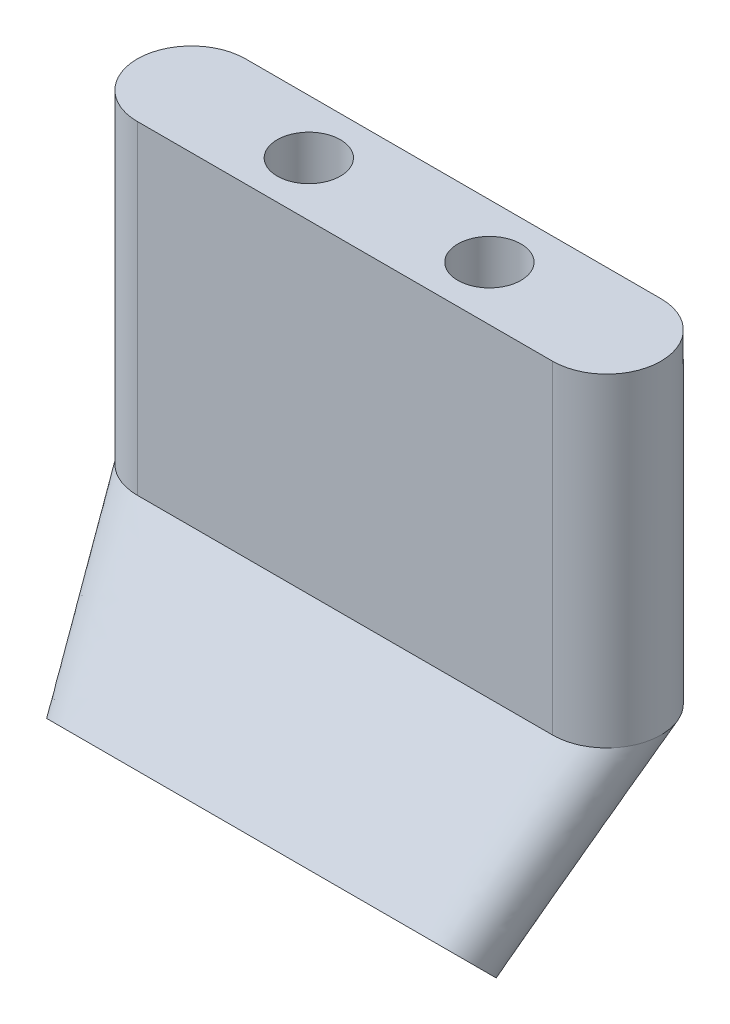
ISO-10303-21;
HEADER;
FILE_DESCRIPTION(('STEP AP214'),'2;1');
FILE_NAME('part.step','',(''),(''),'','','');
FILE_SCHEMA(('AUTOMOTIVE_DESIGN { 1 0 10303 214 1 1 1 1 }'));
ENDSEC;
DATA;
#1=APPLICATION_CONTEXT('core data for automotive mechanical design processes');
#2=APPLICATION_PROTOCOL_DEFINITION('international standard','automotive_design',2000,#1);
#3=PRODUCT_CONTEXT('',#1,'mechanical');
#4=PRODUCT('Part','Part','',(#3));
#5=PRODUCT_RELATED_PRODUCT_CATEGORY('part','',(#4));
#6=PRODUCT_DEFINITION_FORMATION('','',#4);
#7=PRODUCT_DEFINITION_CONTEXT('part definition',#1,'design');
#8=PRODUCT_DEFINITION('design','',#6,#7);
#9=PRODUCT_DEFINITION_SHAPE('','',#8);
#10=(LENGTH_UNIT() NAMED_UNIT(*) SI_UNIT(.MILLI.,.METRE.));
#11=(NAMED_UNIT(*) PLANE_ANGLE_UNIT() SI_UNIT($,.RADIAN.));
#12=(NAMED_UNIT(*) SI_UNIT($,.STERADIAN.) SOLID_ANGLE_UNIT());
#13=UNCERTAINTY_MEASURE_WITH_UNIT(LENGTH_MEASURE(1.E-05),#10,'distance_accuracy_value','');
#14=(GEOMETRIC_REPRESENTATION_CONTEXT(3) GLOBAL_UNCERTAINTY_ASSIGNED_CONTEXT((#13)) GLOBAL_UNIT_ASSIGNED_CONTEXT((#10,
#11,#12)) REPRESENTATION_CONTEXT('',''));
#15=CARTESIAN_POINT('',(0.,0.,0.));
#16=DIRECTION('',(0.,0.,1.));
#17=DIRECTION('',(1.,0.,0.));
#18=AXIS2_PLACEMENT_3D('',#15,#16,#17);
#19=CARTESIAN_POINT('',(-11.5,-47.5431179780562,3.));
#20=DIRECTION('',(0.,0.,1.));
#21=DIRECTION('',(1.,0.,0.));
#22=AXIS2_PLACEMENT_3D('',#19,#20,#21);
#23=PLANE('',#22);
#24=DIRECTION('',(0.,1.,0.));
#25=VECTOR('',#24,1.);
#26=CARTESIAN_POINT('',(-11.5,-47.5431179780562,3.));
#27=LINE('',#26,#25);
#28=CARTESIAN_POINT('',(-11.5,-17.9289321881345,3.));
#29=VERTEX_POINT('',#28);
#30=CARTESIAN_POINT('',(-11.5,0.,3.));
#31=VERTEX_POINT('',#30);
#32=EDGE_CURVE('E217',#29,#31,#27,.T.);
#33=ORIENTED_EDGE('',*,*,#32,.F.);
#34=CARTESIAN_POINT('',(11.4999999975804,-17.9289321881345,-3.));
#35=CARTESIAN_POINT('',(11.8578365670667,-17.9289321881345,-3.));
#36=CARTESIAN_POINT('',(12.5966197600816,-17.9289321881345,-2.87052873644694));
#37=CARTESIAN_POINT('',(13.6077675479962,-17.9289321881345,-2.246019289542));
#38=CARTESIAN_POINT('',(14.3260485170121,-17.9289321881345,-1.23804932232551));
#39=CARTESIAN_POINT('',(14.587292026953,-17.9289321881345,0.));
#40=CARTESIAN_POINT('',(14.3260485170121,-17.9289321881345,1.23804932232552));
#41=CARTESIAN_POINT('',(13.6077675479962,-17.9289321881345,2.24601928954199));
#42=CARTESIAN_POINT('',(12.5966197600816,-17.9289321881345,2.87052873644694));
#43=CARTESIAN_POINT('',(11.8578365670667,-17.9289321881345,3.));
#44=CARTESIAN_POINT('',(9.51360830978022,-17.9289321881345,3.));
#45=CARTESIAN_POINT('',(5.65083750807717,-17.9289321881345,3.));
#46=CARTESIAN_POINT('',(0.,-17.9289321881345,3.));
#47=CARTESIAN_POINT('',(-5.65083750807716,-17.9289321881345,3.));
#48=CARTESIAN_POINT('',(-9.51360830978022,-17.9289321881345,3.));
#49=CARTESIAN_POINT('',(-11.8578365670667,-17.9289321881345,3.));
#50=CARTESIAN_POINT('',(-12.5966197600816,-17.9289321881345,2.87052873644694));
#51=CARTESIAN_POINT('',(-13.6077675479962,-17.9289321881345,2.24601928954199));
#52=CARTESIAN_POINT('',(-14.3260485170121,-17.9289321881345,1.23804932232552));
#53=CARTESIAN_POINT('',(-14.5872920269529,-17.9289321881345,0.));
#54=CARTESIAN_POINT('',(-14.3260485170121,-17.9289321881345,-1.23804932232552));
#55=CARTESIAN_POINT('',(-13.6077675479961,-17.9289321881345,-2.246019289542));
#56=CARTESIAN_POINT('',(-12.5966197600817,-17.9289321881345,-2.87052873644694));
#57=CARTESIAN_POINT('',(-11.8578365670667,-17.9289321881345,-3.));
#58=CARTESIAN_POINT('',(-9.51360830978022,-17.9289321881345,-3.));
#59=CARTESIAN_POINT('',(-5.65083750807715,-17.9289321881345,-3.));
#60=CARTESIAN_POINT('',(0.,-17.9289321881345,-3.));
#61=CARTESIAN_POINT('',(5.65083750807716,-17.9289321881345,-3.));
#62=CARTESIAN_POINT('',(9.51360830978022,-17.9289321881345,-3.));
#63=CARTESIAN_POINT('',(11.4999999975804,-17.9289321881345,-3.));
#64=B_SPLINE_CURVE_WITH_KNOTS('',3,(#34,#35,#36,#37,#38,#39,#40,#41,#42,#43,#44,#45,#46,#47,#48,
#49,#50,#51,#52,#53,#54,#55,#56,#57,#58,#59,#60,#61,#62,#63),.UNSPECIFIED.,.T.,.F.,(4,1,1,1,1,1,
1,1,2,1,1,1,2,1,1,1,1,1,1,1,2,1,1,1,4),(0.,0.0165538482802462,0.0331076965604925,
0.0496615448407387,0.0662153931209849,0.0827692414012312,0.0993230896814774,0.115876937961724,
0.13243078624197,0.224323089681477,0.316215393120985,0.408107696560492,0.5,0.516553848280246,
0.533107696560492,0.549661544840739,0.566215393120985,0.582769241401231,0.599323089681477,
0.615876937961723,0.63243078624197,0.724323089681477,0.816215393120985,0.908107696560492,1.),.UNSPECIFIED.);
#65=CARTESIAN_POINT('',(11.5,-17.9289321881345,3.));
#66=VERTEX_POINT('',#65);
#67=EDGE_CURVE('E293',#29,#66,#64,.F.);
#68=ORIENTED_EDGE('',*,*,#67,.T.);
#69=DIRECTION('',(0.,1.,0.));
#70=VECTOR('',#69,1.);
#71=CARTESIAN_POINT('',(11.5,-47.5431179780562,3.));
#72=LINE('',#71,#70);
#73=CARTESIAN_POINT('',(11.5,0.,3.));
#74=VERTEX_POINT('',#73);
#75=EDGE_CURVE('E301',#66,#74,#72,.T.);
#76=ORIENTED_EDGE('',*,*,#75,.T.);
#77=DIRECTION('',(1.,0.,0.));
#78=VECTOR('',#77,1.);
#79=CARTESIAN_POINT('',(-11.5,0.,3.));
#80=LINE('',#79,#78);
#81=EDGE_CURVE('E236',#31,#74,#80,.T.);
#82=ORIENTED_EDGE('',*,*,#81,.F.);
#83=EDGE_LOOP('',(#33,#68,#76,#82));
#84=FACE_BOUND('',#83,.T.);
#85=ADVANCED_FACE('F169',(#84),#23,.T.);
#86=CARTESIAN_POINT('',(-11.5,-47.5431179780562,0.));
#87=DIRECTION('',(0.,1.,0.));
#88=DIRECTION('',(0.,0.,1.));
#89=AXIS2_PLACEMENT_3D('',#86,#87,#88);
#90=CYLINDRICAL_SURFACE('',#89,3.);
#91=DIRECTION('',(0.,1.,0.));
#92=VECTOR('',#91,1.);
#93=CARTESIAN_POINT('',(-11.5,-47.5431179780562,-3.));
#94=LINE('',#93,#92);
#95=CARTESIAN_POINT('',(-11.5,-17.9289321881345,-3.));
#96=VERTEX_POINT('',#95);
#97=CARTESIAN_POINT('',(-11.5,0.,-3.));
#98=VERTEX_POINT('',#97);
#99=EDGE_CURVE('E207',#96,#98,#94,.T.);
#100=ORIENTED_EDGE('',*,*,#99,.F.);
#101=CARTESIAN_POINT('',(11.4999999975804,-17.9289321881345,-3.));
#102=CARTESIAN_POINT('',(11.8578365670667,-17.9289321881345,-3.));
#103=CARTESIAN_POINT('',(12.5966197600816,-17.9289321881345,-2.87052873644694));
#104=CARTESIAN_POINT('',(13.6077675479962,-17.9289321881345,-2.246019289542));
#105=CARTESIAN_POINT('',(14.3260485170121,-17.9289321881345,-1.23804932232551));
#106=CARTESIAN_POINT('',(14.587292026953,-17.9289321881345,0.));
#107=CARTESIAN_POINT('',(14.3260485170121,-17.9289321881345,1.23804932232552));
#108=CARTESIAN_POINT('',(13.6077675479962,-17.9289321881345,2.24601928954199));
#109=CARTESIAN_POINT('',(12.5966197600816,-17.9289321881345,2.87052873644694));
#110=CARTESIAN_POINT('',(11.8578365670667,-17.9289321881345,3.));
#111=CARTESIAN_POINT('',(9.51360830978022,-17.9289321881345,3.));
#112=CARTESIAN_POINT('',(5.65083750807717,-17.9289321881345,3.));
#113=CARTESIAN_POINT('',(0.,-17.9289321881345,3.));
#114=CARTESIAN_POINT('',(-5.65083750807716,-17.9289321881345,3.));
#115=CARTESIAN_POINT('',(-9.51360830978022,-17.9289321881345,3.));
#116=CARTESIAN_POINT('',(-11.8578365670667,-17.9289321881345,3.));
#117=CARTESIAN_POINT('',(-12.5966197600816,-17.9289321881345,2.87052873644694));
#118=CARTESIAN_POINT('',(-13.6077675479962,-17.9289321881345,2.24601928954199));
#119=CARTESIAN_POINT('',(-14.3260485170121,-17.9289321881345,1.23804932232552));
#120=CARTESIAN_POINT('',(-14.5872920269529,-17.9289321881345,0.));
#121=CARTESIAN_POINT('',(-14.3260485170121,-17.9289321881345,-1.23804932232552));
#122=CARTESIAN_POINT('',(-13.6077675479961,-17.9289321881345,-2.246019289542));
#123=CARTESIAN_POINT('',(-12.5966197600817,-17.9289321881345,-2.87052873644694));
#124=CARTESIAN_POINT('',(-11.8578365670667,-17.9289321881345,-3.));
#125=CARTESIAN_POINT('',(-9.51360830978022,-17.9289321881345,-3.));
#126=CARTESIAN_POINT('',(-5.65083750807715,-17.9289321881345,-3.));
#127=CARTESIAN_POINT('',(0.,-17.9289321881345,-3.));
#128=CARTESIAN_POINT('',(5.65083750807716,-17.9289321881345,-3.));
#129=CARTESIAN_POINT('',(9.51360830978022,-17.9289321881345,-3.));
#130=CARTESIAN_POINT('',(11.4999999975804,-17.9289321881345,-3.));
#131=B_SPLINE_CURVE_WITH_KNOTS('',3,(#101,#102,#103,#104,#105,#106,#107,#108,#109,#110,#111,
#112,#113,#114,#115,#116,#117,#118,#119,#120,#121,#122,#123,#124,#125,#126,#127,#128,#129,#130),
.UNSPECIFIED.,.T.,.F.,(4,1,1,1,1,1,1,1,2,1,1,1,2,1,1,1,1,1,1,1,2,1,1,1,4),(0.,
0.0165538482802462,0.0331076965604925,0.0496615448407387,0.0662153931209849,0.0827692414012312,
0.0993230896814774,0.115876937961724,0.13243078624197,0.224323089681477,0.316215393120985,
0.408107696560492,0.5,0.516553848280246,0.533107696560492,0.549661544840739,0.566215393120985,
0.582769241401231,0.599323089681477,0.615876937961723,0.63243078624197,0.724323089681477,
0.816215393120985,0.908107696560492,1.),.UNSPECIFIED.);
#132=EDGE_CURVE('E260',#96,#29,#131,.F.);
#133=ORIENTED_EDGE('',*,*,#132,.T.);
#134=ORIENTED_EDGE('',*,*,#32,.T.);
#135=CARTESIAN_POINT('',(-11.5,0.,0.));
#136=DIRECTION('',(0.,1.,0.));
#137=DIRECTION('',(0.,0.,1.));
#138=AXIS2_PLACEMENT_3D('',#135,#136,#137);
#139=CIRCLE('',#138,3.);
#140=EDGE_CURVE('E223',#98,#31,#139,.T.);
#141=ORIENTED_EDGE('',*,*,#140,.F.);
#142=EDGE_LOOP('',(#100,#133,#134,#141));
#143=FACE_BOUND('',#142,.T.);
#144=ADVANCED_FACE('F229',(#143),#90,.T.);
#145=CARTESIAN_POINT('',(-11.5,-47.5431179780562,-3.));
#146=DIRECTION('',(0.,0.,1.));
#147=DIRECTION('',(1.,0.,0.));
#148=AXIS2_PLACEMENT_3D('',#145,#146,#147);
#149=PLANE('',#148);
#150=CARTESIAN_POINT('',(11.4999999975804,-17.9289321881345,-3.));
#151=CARTESIAN_POINT('',(11.8578365670667,-17.9289321881345,-3.));
#152=CARTESIAN_POINT('',(12.5966197600816,-17.9289321881345,-2.87052873644694));
#153=CARTESIAN_POINT('',(13.6077675479962,-17.9289321881345,-2.246019289542));
#154=CARTESIAN_POINT('',(14.3260485170121,-17.9289321881345,-1.23804932232551));
#155=CARTESIAN_POINT('',(14.587292026953,-17.9289321881345,0.));
#156=CARTESIAN_POINT('',(14.3260485170121,-17.9289321881345,1.23804932232552));
#157=CARTESIAN_POINT('',(13.6077675479962,-17.9289321881345,2.24601928954199));
#158=CARTESIAN_POINT('',(12.5966197600816,-17.9289321881345,2.87052873644694));
#159=CARTESIAN_POINT('',(11.8578365670667,-17.9289321881345,3.));
#160=CARTESIAN_POINT('',(9.51360830978022,-17.9289321881345,3.));
#161=CARTESIAN_POINT('',(5.65083750807717,-17.9289321881345,3.));
#162=CARTESIAN_POINT('',(0.,-17.9289321881345,3.));
#163=CARTESIAN_POINT('',(-5.65083750807716,-17.9289321881345,3.));
#164=CARTESIAN_POINT('',(-9.51360830978022,-17.9289321881345,3.));
#165=CARTESIAN_POINT('',(-11.8578365670667,-17.9289321881345,3.));
#166=CARTESIAN_POINT('',(-12.5966197600816,-17.9289321881345,2.87052873644694));
#167=CARTESIAN_POINT('',(-13.6077675479962,-17.9289321881345,2.24601928954199));
#168=CARTESIAN_POINT('',(-14.3260485170121,-17.9289321881345,1.23804932232552));
#169=CARTESIAN_POINT('',(-14.5872920269529,-17.9289321881345,0.));
#170=CARTESIAN_POINT('',(-14.3260485170121,-17.9289321881345,-1.23804932232552));
#171=CARTESIAN_POINT('',(-13.6077675479961,-17.9289321881345,-2.24601928954199));
#172=CARTESIAN_POINT('',(-12.5966197600817,-17.9289321881345,-2.87052873644694));
#173=CARTESIAN_POINT('',(-11.8578365670667,-17.9289321881345,-3.));
#174=CARTESIAN_POINT('',(-9.51360830978022,-17.9289321881345,-3.));
#175=CARTESIAN_POINT('',(-5.65083750807715,-17.9289321881345,-3.));
#176=CARTESIAN_POINT('',(0.,-17.9289321881345,-3.));
#177=CARTESIAN_POINT('',(5.65083750807716,-17.9289321881345,-3.));
#178=CARTESIAN_POINT('',(9.51360830978022,-17.9289321881345,-3.));
#179=CARTESIAN_POINT('',(11.4999999975804,-17.9289321881345,-3.));
#180=B_SPLINE_CURVE_WITH_KNOTS('',3,(#150,#151,#152,#153,#154,#155,#156,#157,#158,#159,#160,
#161,#162,#163,#164,#165,#166,#167,#168,#169,#170,#171,#172,#173,#174,#175,#176,#177,#178,#179),
.UNSPECIFIED.,.T.,.F.,(4,1,1,1,1,1,1,1,2,1,1,1,2,1,1,1,1,1,1,1,2,1,1,1,4),(0.,
0.0165538482802462,0.0331076965604925,0.0496615448407387,0.0662153931209849,0.0827692414012312,
0.0993230896814774,0.115876937961724,0.13243078624197,0.224323089681477,0.316215393120985,
0.408107696560492,0.5,0.516553848280246,0.533107696560492,0.549661544840739,0.566215393120985,
0.582769241401231,0.599323089681477,0.615876937961723,0.63243078624197,0.724323089681477,
0.816215393120985,0.908107696560492,1.),.UNSPECIFIED.);
#181=CARTESIAN_POINT('',(11.5,-17.9289321881345,-3.));
#182=VERTEX_POINT('',#181);
#183=EDGE_CURVE('E191',#96,#182,#180,.T.);
#184=ORIENTED_EDGE('',*,*,#183,.F.);
#185=ORIENTED_EDGE('',*,*,#99,.T.);
#186=DIRECTION('',(1.,0.,0.));
#187=VECTOR('',#186,1.);
#188=CARTESIAN_POINT('',(-11.5,0.,-3.));
#189=LINE('',#188,#187);
#190=CARTESIAN_POINT('',(11.5,0.,-3.));
#191=VERTEX_POINT('',#190);
#192=EDGE_CURVE('E210',#98,#191,#189,.T.);
#193=ORIENTED_EDGE('',*,*,#192,.T.);
#194=DIRECTION('',(0.,1.,0.));
#195=VECTOR('',#194,1.);
#196=CARTESIAN_POINT('',(11.5,-47.5431179780562,-3.));
#197=LINE('',#196,#195);
#198=EDGE_CURVE('E251',#182,#191,#197,.T.);
#199=ORIENTED_EDGE('',*,*,#198,.F.);
#200=EDGE_LOOP('',(#184,#185,#193,#199));
#201=FACE_BOUND('',#200,.T.);
#202=ADVANCED_FACE('F209',(#201),#149,.F.);
#203=CARTESIAN_POINT('',(11.5,-47.5431179780562,0.));
#204=DIRECTION('',(0.,1.,0.));
#205=DIRECTION('',(0.,0.,1.));
#206=AXIS2_PLACEMENT_3D('',#203,#204,#205);
#207=CYLINDRICAL_SURFACE('',#206,3.);
#208=ORIENTED_EDGE('',*,*,#75,.F.);
#209=CARTESIAN_POINT('',(11.4999999975804,-17.9289321881345,-3.));
#210=CARTESIAN_POINT('',(11.8578365670667,-17.9289321881345,-3.));
#211=CARTESIAN_POINT('',(12.5966197600816,-17.9289321881345,-2.87052873644694));
#212=CARTESIAN_POINT('',(13.6077675479962,-17.9289321881345,-2.246019289542));
#213=CARTESIAN_POINT('',(14.3260485170121,-17.9289321881345,-1.23804932232551));
#214=CARTESIAN_POINT('',(14.587292026953,-17.9289321881345,0.));
#215=CARTESIAN_POINT('',(14.3260485170121,-17.9289321881345,1.23804932232552));
#216=CARTESIAN_POINT('',(13.6077675479962,-17.9289321881345,2.24601928954199));
#217=CARTESIAN_POINT('',(12.5966197600816,-17.9289321881345,2.87052873644694));
#218=CARTESIAN_POINT('',(11.8578365670667,-17.9289321881345,3.));
#219=CARTESIAN_POINT('',(9.51360830978022,-17.9289321881345,3.));
#220=CARTESIAN_POINT('',(5.65083750807717,-17.9289321881345,3.));
#221=CARTESIAN_POINT('',(0.,-17.9289321881345,3.));
#222=CARTESIAN_POINT('',(-5.65083750807716,-17.9289321881345,3.));
#223=CARTESIAN_POINT('',(-9.51360830978022,-17.9289321881345,3.));
#224=CARTESIAN_POINT('',(-11.8578365670667,-17.9289321881345,3.));
#225=CARTESIAN_POINT('',(-12.5966197600816,-17.9289321881345,2.87052873644694));
#226=CARTESIAN_POINT('',(-13.6077675479962,-17.9289321881345,2.24601928954199));
#227=CARTESIAN_POINT('',(-14.3260485170121,-17.9289321881345,1.23804932232552));
#228=CARTESIAN_POINT('',(-14.5872920269529,-17.9289321881345,0.));
#229=CARTESIAN_POINT('',(-14.3260485170121,-17.9289321881345,-1.23804932232552));
#230=CARTESIAN_POINT('',(-13.6077675479961,-17.9289321881345,-2.246019289542));
#231=CARTESIAN_POINT('',(-12.5966197600817,-17.9289321881345,-2.87052873644694));
#232=CARTESIAN_POINT('',(-11.8578365670667,-17.9289321881345,-3.));
#233=CARTESIAN_POINT('',(-9.51360830978022,-17.9289321881345,-3.));
#234=CARTESIAN_POINT('',(-5.65083750807715,-17.9289321881345,-3.));
#235=CARTESIAN_POINT('',(0.,-17.9289321881345,-3.));
#236=CARTESIAN_POINT('',(5.65083750807716,-17.9289321881345,-3.));
#237=CARTESIAN_POINT('',(9.51360830978022,-17.9289321881345,-3.));
#238=CARTESIAN_POINT('',(11.4999999975804,-17.9289321881345,-3.));
#239=B_SPLINE_CURVE_WITH_KNOTS('',3,(#209,#210,#211,#212,#213,#214,#215,#216,#217,#218,#219,
#220,#221,#222,#223,#224,#225,#226,#227,#228,#229,#230,#231,#232,#233,#234,#235,#236,#237,#238),
.UNSPECIFIED.,.T.,.F.,(4,1,1,1,1,1,1,1,2,1,1,1,2,1,1,1,1,1,1,1,2,1,1,1,4),(0.,
0.0165538482802462,0.0331076965604925,0.0496615448407387,0.0662153931209849,0.0827692414012312,
0.0993230896814774,0.115876937961724,0.13243078624197,0.224323089681477,0.316215393120985,
0.408107696560492,0.5,0.516553848280246,0.533107696560492,0.549661544840739,0.566215393120985,
0.582769241401231,0.599323089681477,0.615876937961723,0.63243078624197,0.724323089681477,
0.816215393120985,0.908107696560492,1.),.UNSPECIFIED.);
#240=EDGE_CURVE('E227',#66,#182,#239,.F.);
#241=ORIENTED_EDGE('',*,*,#240,.T.);
#242=ORIENTED_EDGE('',*,*,#198,.T.);
#243=CARTESIAN_POINT('',(11.5,0.,0.));
#244=DIRECTION('',(0.,1.,0.));
#245=DIRECTION('',(0.,0.,1.));
#246=AXIS2_PLACEMENT_3D('',#243,#244,#245);
#247=CIRCLE('',#246,3.);
#248=EDGE_CURVE('E225',#74,#191,#247,.T.);
#249=ORIENTED_EDGE('',*,*,#248,.F.);
#250=EDGE_LOOP('',(#208,#241,#242,#249));
#251=FACE_BOUND('',#250,.T.);
#252=ADVANCED_FACE('F309',(#251),#207,.T.);
#253=CARTESIAN_POINT('',(-5.,-47.5431179780562,0.));
#254=DIRECTION('',(0.,1.,0.));
#255=DIRECTION('',(0.,0.,1.));
#256=AXIS2_PLACEMENT_3D('',#253,#254,#255);
#257=CYLINDRICAL_SURFACE('',#256,1.75);
#258=CARTESIAN_POINT('',(-5.,0.,0.));
#259=DIRECTION('',(0.,1.,0.));
#260=DIRECTION('',(0.,0.,1.));
#261=AXIS2_PLACEMENT_3D('',#258,#259,#260);
#262=CIRCLE('',#261,1.75);
#263=CARTESIAN_POINT('',(-5.,0.,1.75));
#264=VERTEX_POINT('',#263);
#265=EDGE_CURVE('E247',#264,#264,#262,.T.);
#266=CARTESIAN_POINT('',(-5.,-17.9289321881345,0.));
#267=DIRECTION('',(0.,-1.,0.));
#268=DIRECTION('',(0.,0.,-1.));
#269=AXIS2_PLACEMENT_3D('',#266,#267,#268);
#270=CIRCLE('',#269,1.75);
#271=CARTESIAN_POINT('',(-5.,-17.9289321881345,1.75));
#272=VERTEX_POINT('',#271);
#273=EDGE_CURVE('E12',#272,#272,#270,.F.);
#274=CARTESIAN_POINT('',(-5.,0.,1.75));
#275=CARTESIAN_POINT('',(-5.,-0.186759710293074,1.75));
#276=CARTESIAN_POINT('',(-5.,-0.37351942058614,1.75));
#277=CARTESIAN_POINT('',(-5.,-0.747038841172276,1.75));
#278=CARTESIAN_POINT('',(-5.,-0.933798551465345,1.75));
#279=CARTESIAN_POINT('',(-5.,-1.30731797205148,1.75));
#280=CARTESIAN_POINT('',(-5.,-1.49407768234455,1.75));
#281=CARTESIAN_POINT('',(-5.,-1.86759710293068,1.75));
#282=CARTESIAN_POINT('',(-5.,-2.05435681322375,1.75));
#283=CARTESIAN_POINT('',(-5.,-2.42787623380989,1.75));
#284=CARTESIAN_POINT('',(-5.,-2.61463594410295,1.75));
#285=CARTESIAN_POINT('',(-5.,-2.98815536468909,1.75));
#286=CARTESIAN_POINT('',(-5.,-3.17491507498216,1.75));
#287=CARTESIAN_POINT('',(-5.,-3.54843449556829,1.75));
#288=CARTESIAN_POINT('',(-5.,-3.73519420586136,1.75));
#289=CARTESIAN_POINT('',(-5.,-4.1087136264475,1.75));
#290=CARTESIAN_POINT('',(-5.,-4.29547333674056,1.75));
#291=CARTESIAN_POINT('',(-5.,-4.6689927573267,1.75));
#292=CARTESIAN_POINT('',(-5.,-4.85575246761977,1.75));
#293=CARTESIAN_POINT('',(-5.,-5.2292718882059,1.75));
#294=CARTESIAN_POINT('',(-5.,-5.41603159849897,1.75));
#295=CARTESIAN_POINT('',(-5.,-5.78955101908511,1.75));
#296=CARTESIAN_POINT('',(-5.,-5.97631072937817,1.75));
#297=CARTESIAN_POINT('',(-5.,-6.34983014996431,1.75));
#298=CARTESIAN_POINT('',(-5.,-6.53658986025738,1.75));
#299=CARTESIAN_POINT('',(-5.,-6.91010928084351,1.75));
#300=CARTESIAN_POINT('',(-5.,-7.09686899113658,1.75));
#301=CARTESIAN_POINT('',(-5.,-7.47038841172271,1.75));
#302=CARTESIAN_POINT('',(-5.,-7.65714812201578,1.75));
#303=CARTESIAN_POINT('',(-5.,-8.03066754260192,1.75));
#304=CARTESIAN_POINT('',(-5.,-8.21742725289498,1.75));
#305=CARTESIAN_POINT('',(-5.,-8.59094667348112,1.75));
#306=CARTESIAN_POINT('',(-5.,-8.77770638377418,1.75));
#307=CARTESIAN_POINT('',(-5.,-9.15122580436032,1.75));
#308=CARTESIAN_POINT('',(-5.,-9.33798551465339,1.75));
#309=CARTESIAN_POINT('',(-5.,-9.71150493523953,1.75));
#310=CARTESIAN_POINT('',(-5.,-9.89826464553259,1.75));
#311=CARTESIAN_POINT('',(-5.,-10.2717840661187,1.75));
#312=CARTESIAN_POINT('',(-5.,-10.4585437764118,1.75));
#313=CARTESIAN_POINT('',(-5.,-10.8320631969979,1.75));
#314=CARTESIAN_POINT('',(-5.,-11.018822907291,1.75));
#315=CARTESIAN_POINT('',(-5.,-11.3923423278771,1.75));
#316=CARTESIAN_POINT('',(-5.,-11.5791020381702,1.75));
#317=CARTESIAN_POINT('',(-5.,-11.9526214587563,1.75));
#318=CARTESIAN_POINT('',(-5.,-12.1393811690494,1.75));
#319=CARTESIAN_POINT('',(-5.,-12.5129005896355,1.75));
#320=CARTESIAN_POINT('',(-5.,-12.6996602999286,1.75));
#321=CARTESIAN_POINT('',(-5.,-13.0731797205147,1.75));
#322=CARTESIAN_POINT('',(-5.,-13.2599394308078,1.75));
#323=CARTESIAN_POINT('',(-5.,-13.6334588513939,1.75));
#324=CARTESIAN_POINT('',(-5.,-13.820218561687,1.75));
#325=CARTESIAN_POINT('',(-5.,-14.1937379822731,1.75));
#326=CARTESIAN_POINT('',(-5.,-14.3804976925662,1.75));
#327=CARTESIAN_POINT('',(-5.,-14.7540171131523,1.75));
#328=CARTESIAN_POINT('',(-5.,-14.9407768234454,1.75));
#329=CARTESIAN_POINT('',(-5.,-15.3142962440316,1.75));
#330=CARTESIAN_POINT('',(-5.,-15.5010559543246,1.75));
#331=CARTESIAN_POINT('',(-5.,-15.8745753749108,1.75));
#332=CARTESIAN_POINT('',(-5.,-16.0613350852038,1.75));
#333=CARTESIAN_POINT('',(-5.,-16.43485450579,1.75));
#334=CARTESIAN_POINT('',(-5.,-16.621614216083,1.75));
#335=CARTESIAN_POINT('',(-5.,-16.9951336366692,1.75));
#336=CARTESIAN_POINT('',(-5.,-17.1818933469622,1.75));
#337=CARTESIAN_POINT('',(-5.,-17.5554127675484,1.75));
#338=CARTESIAN_POINT('',(-5.,-17.7421724778414,1.75));
#339=CARTESIAN_POINT('',(-5.,-17.9289321881345,1.75));
#340=B_SPLINE_CURVE_WITH_KNOTS('',3,(#274,#275,#276,#277,#278,#279,#280,#281,#282,#283,#284,
#285,#286,#287,#288,#289,#290,#291,#292,#293,#294,#295,#296,#297,#298,#299,#300,#301,#302,#303,
#304,#305,#306,#307,#308,#309,#310,#311,#312,#313,#314,#315,#316,#317,#318,#319,#320,#321,#322,
#323,#324,#325,#326,#327,#328,#329,#330,#331,#332,#333,#334,#335,#336,#337,#338,#339),
.UNSPECIFIED.,.F.,.F.,(4,2,2,2,2,2,2,2,2,2,2,2,2,2,2,2,2,2,2,2,2,2,2,2,2,2,2,2,2,2,2,2,4),(0.,
0.5602791308792,1.12055826175841,1.68083739263761,2.24111652351681,2.80139565439601,
3.36167478527521,3.92195391615442,4.48223304703362,5.04251217791283,5.60279130879203,
6.16307043967124,6.72334957055044,7.28362870142964,7.84390783230884,8.40418696318804,
8.96446609406724,9.52474522494645,10.0850243558257,10.6453034867049,11.2055826175841,
11.7658617484633,12.3261408793425,12.8864200102217,13.4466991411009,14.0069782719801,
14.5672574028593,15.1275365337385,15.6878156646177,16.2480947954969,16.8083739263761,
17.3686530572553,17.9289321881345),.UNSPECIFIED.);
#341=EDGE_CURVE('BSEAM278',#264,#272,#340,.T.);
#342=ORIENTED_EDGE('',*,*,#265,.T.);
#343=ORIENTED_EDGE('',*,*,#273,.F.);
#344=ORIENTED_EDGE('',*,*,#341,.T.);
#345=ORIENTED_EDGE('',*,*,#341,.F.);
#346=EDGE_LOOP('',(#342,#344,#343,#345));
#347=FACE_BOUND('',#346,.T.);
#348=ADVANCED_FACE('F278',(#347),#257,.F.);
#349=CARTESIAN_POINT('',(5.,-47.5431179780562,0.));
#350=DIRECTION('',(0.,1.,0.));
#351=DIRECTION('',(0.,0.,1.));
#352=AXIS2_PLACEMENT_3D('',#349,#350,#351);
#353=CYLINDRICAL_SURFACE('',#352,1.75);
#354=CARTESIAN_POINT('',(5.,0.,0.));
#355=DIRECTION('',(0.,1.,0.));
#356=DIRECTION('',(0.,0.,1.));
#357=AXIS2_PLACEMENT_3D('',#354,#355,#356);
#358=CIRCLE('',#357,1.75);
#359=CARTESIAN_POINT('',(5.,0.,1.75));
#360=VERTEX_POINT('',#359);
#361=EDGE_CURVE('E246',#360,#360,#358,.T.);
#362=CARTESIAN_POINT('',(5.,-17.9289321881345,0.));
#363=DIRECTION('',(0.,-1.,0.));
#364=DIRECTION('',(0.,0.,-1.));
#365=AXIS2_PLACEMENT_3D('',#362,#363,#364);
#366=CIRCLE('',#365,1.75);
#367=CARTESIAN_POINT('',(5.,-17.9289321881345,1.75));
#368=VERTEX_POINT('',#367);
#369=EDGE_CURVE('E182',#368,#368,#366,.F.);
#370=CARTESIAN_POINT('',(5.,0.,1.75));
#371=CARTESIAN_POINT('',(5.,-0.186759710293074,1.75));
#372=CARTESIAN_POINT('',(5.,-0.37351942058614,1.75));
#373=CARTESIAN_POINT('',(5.,-0.747038841172276,1.75));
#374=CARTESIAN_POINT('',(5.,-0.933798551465345,1.75));
#375=CARTESIAN_POINT('',(5.,-1.30731797205148,1.75));
#376=CARTESIAN_POINT('',(5.,-1.49407768234455,1.75));
#377=CARTESIAN_POINT('',(5.,-1.86759710293068,1.75));
#378=CARTESIAN_POINT('',(5.,-2.05435681322375,1.75));
#379=CARTESIAN_POINT('',(5.,-2.42787623380989,1.75));
#380=CARTESIAN_POINT('',(5.,-2.61463594410295,1.75));
#381=CARTESIAN_POINT('',(5.,-2.98815536468909,1.75));
#382=CARTESIAN_POINT('',(5.,-3.17491507498216,1.75));
#383=CARTESIAN_POINT('',(5.,-3.54843449556829,1.75));
#384=CARTESIAN_POINT('',(5.,-3.73519420586136,1.75));
#385=CARTESIAN_POINT('',(5.,-4.1087136264475,1.75));
#386=CARTESIAN_POINT('',(5.,-4.29547333674056,1.75));
#387=CARTESIAN_POINT('',(5.,-4.6689927573267,1.75));
#388=CARTESIAN_POINT('',(5.,-4.85575246761977,1.75));
#389=CARTESIAN_POINT('',(5.,-5.2292718882059,1.75));
#390=CARTESIAN_POINT('',(5.,-5.41603159849897,1.75));
#391=CARTESIAN_POINT('',(5.,-5.78955101908511,1.75));
#392=CARTESIAN_POINT('',(5.,-5.97631072937817,1.75));
#393=CARTESIAN_POINT('',(5.,-6.34983014996431,1.75));
#394=CARTESIAN_POINT('',(5.,-6.53658986025738,1.75));
#395=CARTESIAN_POINT('',(5.,-6.91010928084351,1.75));
#396=CARTESIAN_POINT('',(5.,-7.09686899113658,1.75));
#397=CARTESIAN_POINT('',(5.,-7.47038841172271,1.75));
#398=CARTESIAN_POINT('',(5.,-7.65714812201578,1.75));
#399=CARTESIAN_POINT('',(5.,-8.03066754260192,1.75));
#400=CARTESIAN_POINT('',(5.,-8.21742725289498,1.75));
#401=CARTESIAN_POINT('',(5.,-8.59094667348112,1.75));
#402=CARTESIAN_POINT('',(5.,-8.77770638377418,1.75));
#403=CARTESIAN_POINT('',(5.,-9.15122580436032,1.75));
#404=CARTESIAN_POINT('',(5.,-9.33798551465339,1.75));
#405=CARTESIAN_POINT('',(5.,-9.71150493523953,1.75));
#406=CARTESIAN_POINT('',(5.,-9.89826464553259,1.75));
#407=CARTESIAN_POINT('',(5.,-10.2717840661187,1.75));
#408=CARTESIAN_POINT('',(5.,-10.4585437764118,1.75));
#409=CARTESIAN_POINT('',(5.,-10.8320631969979,1.75));
#410=CARTESIAN_POINT('',(5.,-11.018822907291,1.75));
#411=CARTESIAN_POINT('',(5.,-11.3923423278771,1.75));
#412=CARTESIAN_POINT('',(5.,-11.5791020381702,1.75));
#413=CARTESIAN_POINT('',(5.,-11.9526214587563,1.75));
#414=CARTESIAN_POINT('',(5.,-12.1393811690494,1.75));
#415=CARTESIAN_POINT('',(5.,-12.5129005896355,1.75));
#416=CARTESIAN_POINT('',(5.,-12.6996602999286,1.75));
#417=CARTESIAN_POINT('',(5.,-13.0731797205147,1.75));
#418=CARTESIAN_POINT('',(5.,-13.2599394308078,1.75));
#419=CARTESIAN_POINT('',(5.,-13.6334588513939,1.75));
#420=CARTESIAN_POINT('',(5.,-13.820218561687,1.75));
#421=CARTESIAN_POINT('',(5.,-14.1937379822731,1.75));
#422=CARTESIAN_POINT('',(5.,-14.3804976925662,1.75));
#423=CARTESIAN_POINT('',(5.,-14.7540171131523,1.75));
#424=CARTESIAN_POINT('',(5.,-14.9407768234454,1.75));
#425=CARTESIAN_POINT('',(5.,-15.3142962440316,1.75));
#426=CARTESIAN_POINT('',(5.,-15.5010559543246,1.75));
#427=CARTESIAN_POINT('',(5.,-15.8745753749108,1.75));
#428=CARTESIAN_POINT('',(5.,-16.0613350852038,1.75));
#429=CARTESIAN_POINT('',(5.,-16.43485450579,1.75));
#430=CARTESIAN_POINT('',(5.,-16.621614216083,1.75));
#431=CARTESIAN_POINT('',(5.,-16.9951336366692,1.75));
#432=CARTESIAN_POINT('',(5.,-17.1818933469622,1.75));
#433=CARTESIAN_POINT('',(5.,-17.5554127675484,1.75));
#434=CARTESIAN_POINT('',(5.,-17.7421724778414,1.75));
#435=CARTESIAN_POINT('',(5.,-17.9289321881345,1.75));
#436=B_SPLINE_CURVE_WITH_KNOTS('',3,(#370,#371,#372,#373,#374,#375,#376,#377,#378,#379,#380,
#381,#382,#383,#384,#385,#386,#387,#388,#389,#390,#391,#392,#393,#394,#395,#396,#397,#398,#399,
#400,#401,#402,#403,#404,#405,#406,#407,#408,#409,#410,#411,#412,#413,#414,#415,#416,#417,#418,
#419,#420,#421,#422,#423,#424,#425,#426,#427,#428,#429,#430,#431,#432,#433,#434,#435),
.UNSPECIFIED.,.F.,.F.,(4,2,2,2,2,2,2,2,2,2,2,2,2,2,2,2,2,2,2,2,2,2,2,2,2,2,2,2,2,2,2,2,4),(0.,
0.5602791308792,1.12055826175841,1.68083739263761,2.24111652351681,2.80139565439601,
3.36167478527521,3.92195391615442,4.48223304703362,5.04251217791283,5.60279130879203,
6.16307043967124,6.72334957055044,7.28362870142964,7.84390783230884,8.40418696318804,
8.96446609406724,9.52474522494645,10.0850243558257,10.6453034867049,11.2055826175841,
11.7658617484633,12.3261408793425,12.8864200102217,13.4466991411009,14.0069782719801,
14.5672574028593,15.1275365337385,15.6878156646177,16.2480947954969,16.8083739263761,
17.3686530572553,17.9289321881345),.UNSPECIFIED.);
#437=EDGE_CURVE('BSEAM171',#360,#368,#436,.T.);
#438=ORIENTED_EDGE('',*,*,#361,.T.);
#439=ORIENTED_EDGE('',*,*,#369,.F.);
#440=ORIENTED_EDGE('',*,*,#437,.T.);
#441=ORIENTED_EDGE('',*,*,#437,.F.);
#442=EDGE_LOOP('',(#438,#440,#439,#441));
#443=FACE_BOUND('',#442,.T.);
#444=ADVANCED_FACE('F171',(#443),#353,.F.);
#445=CARTESIAN_POINT('',(11.5,0.,0.));
#446=DIRECTION('',(0.,1.,0.));
#447=DIRECTION('',(0.,0.,1.));
#448=AXIS2_PLACEMENT_3D('',#445,#446,#447);
#449=PLANE('',#448);
#450=ORIENTED_EDGE('',*,*,#361,.F.);
#451=EDGE_LOOP('',(#450));
#452=FACE_BOUND('',#451,.T.);
#453=ORIENTED_EDGE('',*,*,#265,.F.);
#454=EDGE_LOOP('',(#453));
#455=FACE_BOUND('',#454,.T.);
#456=ORIENTED_EDGE('',*,*,#81,.T.);
#457=ORIENTED_EDGE('',*,*,#248,.T.);
#458=ORIENTED_EDGE('',*,*,#192,.F.);
#459=ORIENTED_EDGE('',*,*,#140,.T.);
#460=EDGE_LOOP('',(#456,#457,#458,#459));
#461=FACE_BOUND('',#460,.T.);
#462=ADVANCED_FACE('F222',(#452,#455,#461),#449,.T.);
#463=CARTESIAN_POINT('',(11.5,-17.9289321881345,0.));
#464=DIRECTION('',(0.,-1.,0.));
#465=DIRECTION('',(0.,0.,-1.));
#466=AXIS2_PLACEMENT_3D('',#463,#464,#465);
#467=PLANE('',#466);
#468=ORIENTED_EDGE('',*,*,#273,.T.);
#469=EDGE_LOOP('',(#468));
#470=FACE_BOUND('',#469,.T.);
#471=ADVANCED_FACE('F320',(#470),#467,.F.);
#472=ORIENTED_EDGE('',*,*,#369,.T.);
#473=EDGE_LOOP('',(#472));
#474=FACE_BOUND('',#473,.T.);
#475=ADVANCED_FACE('F327',(#474),#467,.F.);
#476=CARTESIAN_POINT('',(-10.,-27.0710678118655,7.07106781186548));
#477=DIRECTION('',(0.,-0.707106781186547,0.707106781186548));
#478=DIRECTION('',(0.,-0.707106781186548,-0.707106781186547));
#479=AXIS2_PLACEMENT_3D('',#476,#477,#478);
#480=PLANE('',#479);
#481=CARTESIAN_POINT('',(-10.,-27.0710678118655,7.07106781186548));
#482=DIRECTION('',(0.,-0.707106781186547,0.707106781186548));
#483=DIRECTION('',(0.,-0.707106781186548,-0.707106781186547));
#484=AXIS2_PLACEMENT_3D('',#481,#482,#483);
#485=CIRCLE('',#484,2.);
#486=CARTESIAN_POINT('',(-10.,-25.6568542494924,8.48528137423858));
#487=VERTEX_POINT('',#486);
#488=CARTESIAN_POINT('',(-9.99999999999958,-28.4852813742386,5.65685424949239));
#489=VERTEX_POINT('',#488);
#490=EDGE_CURVE('E361',#487,#489,#485,.T.);
#491=ORIENTED_EDGE('',*,*,#490,.T.);
#492=DIRECTION('',(1.,0.,0.));
#493=VECTOR('',#492,1.);
#494=CARTESIAN_POINT('',(-10.,-28.4852813742386,5.65685424949239));
#495=LINE('',#494,#493);
#496=CARTESIAN_POINT('',(9.99999999980052,-28.4852813742386,5.65685424949239));
#497=VERTEX_POINT('',#496);
#498=EDGE_CURVE('E353',#489,#497,#495,.T.);
#499=ORIENTED_EDGE('',*,*,#498,.T.);
#500=CARTESIAN_POINT('',(10.,-27.0710678118655,7.07106781186549));
#501=DIRECTION('',(0.,-0.707106781186547,0.707106781186548));
#502=DIRECTION('',(0.,-0.707106781186548,-0.707106781186547));
#503=AXIS2_PLACEMENT_3D('',#500,#501,#502);
#504=CIRCLE('',#503,2.);
#505=CARTESIAN_POINT('',(10.,-25.6568542494924,8.48528137423858));
#506=VERTEX_POINT('',#505);
#507=EDGE_CURVE('E360',#497,#506,#504,.T.);
#508=ORIENTED_EDGE('',*,*,#507,.T.);
#509=DIRECTION('',(-1.,0.,0.));
#510=VECTOR('',#509,1.);
#511=CARTESIAN_POINT('',(-10.,-25.6568542494924,8.48528137423858));
#512=LINE('',#511,#510);
#513=EDGE_CURVE('E367',#506,#487,#512,.T.);
#514=ORIENTED_EDGE('',*,*,#513,.T.);
#515=EDGE_LOOP('',(#491,#499,#508,#514));
#516=FACE_BOUND('',#515,.T.);
#517=ADVANCED_FACE('F322',(#516),#480,.T.);
#518=CARTESIAN_POINT('',(11.4999999975804,-17.9289321881345,-3.));
#519=CARTESIAN_POINT('',(9.99999999803868,-28.4852813742386,5.65685424949239));
#520=CARTESIAN_POINT('',(11.8578365670667,-17.9289321881345,-3.));
#521=CARTESIAN_POINT('',(10.2900585722831,-28.4852813742386,5.65685424949239));
#522=CARTESIAN_POINT('',(12.5966197600816,-17.9289321881345,-2.87052873644694));
#523=CARTESIAN_POINT('',(10.8398106791566,-28.3964677408002,5.74566788293077));
#524=CARTESIAN_POINT('',(13.6077675479962,-17.9289321881345,-2.246019289542));
#525=CARTESIAN_POINT('',(11.4956022004248,-28.0642671869864,6.07786843674456));
#526=CARTESIAN_POINT('',(14.3260485170121,-17.9289321881345,-1.23804932232551));
#527=CARTESIAN_POINT('',(11.9048155566871,-27.6005473261753,6.54158829755568));
#528=CARTESIAN_POINT('',(14.587292026953,-17.9289321881345,0.));
#529=CARTESIAN_POINT('',(12.0477776935668,-27.0710678118654,7.07106781186547));
#530=CARTESIAN_POINT('',(14.3260485170121,-17.9289321881345,1.23804932232552));
#531=CARTESIAN_POINT('',(11.9048155566871,-26.5415882975556,7.60054732617529));
#532=CARTESIAN_POINT('',(13.6077675479962,-17.9289321881345,2.24601928954199));
#533=CARTESIAN_POINT('',(11.4956022004248,-26.0778684367445,8.06426718698643));
#534=CARTESIAN_POINT('',(12.5966197600816,-17.9289321881345,2.87052873644694));
#535=CARTESIAN_POINT('',(10.8398106791566,-25.7456678829307,8.39646774080021));
#536=CARTESIAN_POINT('',(11.8578365670667,-17.9289321881345,3.));
#537=CARTESIAN_POINT('',(10.2900585722831,-25.6568542494924,8.48528137423858));
#538=CARTESIAN_POINT('',(9.51360830978022,-17.9289321881345,3.));
#539=CARTESIAN_POINT('',(8.38985170693056,-25.6568542494924,8.48528137423858));
#540=CARTESIAN_POINT('',(5.65083750807717,-17.9289321881345,3.));
#541=CARTESIAN_POINT('',(5.08918783262779,-25.6568542494923,8.48528137423856));
#542=CARTESIAN_POINT('',(0.,-17.9289321881345,3.));
#543=CARTESIAN_POINT('',(0.,-25.6568542494924,8.4852813742386));
#544=CARTESIAN_POINT('',(-5.65083750807716,-17.9289321881345,3.));
#545=CARTESIAN_POINT('',(-5.08918783262778,-25.6568542494924,8.48528137423857));
#546=CARTESIAN_POINT('',(-9.51360830978022,-17.9289321881345,3.));
#547=CARTESIAN_POINT('',(-8.38985170693056,-25.6568542494924,8.48528137423858));
#548=CARTESIAN_POINT('',(-11.8578365670667,-17.9289321881345,3.));
#549=CARTESIAN_POINT('',(-10.2900585722831,-25.6568542494924,8.48528137423858));
#550=CARTESIAN_POINT('',(-12.5966197600816,-17.9289321881345,2.87052873644694));
#551=CARTESIAN_POINT('',(-10.8398106791566,-25.7456678829307,8.39646774080021));
#552=CARTESIAN_POINT('',(-13.6077675479962,-17.9289321881345,2.24601928954199));
#553=CARTESIAN_POINT('',(-11.4956022004248,-26.0778684367445,8.06426718698643));
#554=CARTESIAN_POINT('',(-14.3260485170121,-17.9289321881345,1.23804932232552));
#555=CARTESIAN_POINT('',(-11.9048155566871,-26.5415882975557,7.60054732617529));
#556=CARTESIAN_POINT('',(-14.5872920269529,-17.9289321881345,0.));
#557=CARTESIAN_POINT('',(-12.0477776935668,-27.0710678118655,7.07106781186548));
#558=CARTESIAN_POINT('',(-14.3260485170121,-17.9289321881345,-1.23804932232552));
#559=CARTESIAN_POINT('',(-11.9048155566871,-27.6005473261753,6.54158829755567));
#560=CARTESIAN_POINT('',(-13.6077675479961,-17.9289321881345,-2.246019289542));
#561=CARTESIAN_POINT('',(-11.4956022004248,-28.0642671869864,6.07786843674454));
#562=CARTESIAN_POINT('',(-12.5966197600817,-17.9289321881345,-2.87052873644694));
#563=CARTESIAN_POINT('',(-10.8398106791566,-28.3964677408002,5.74566788293076));
#564=CARTESIAN_POINT('',(-11.8578365670667,-17.9289321881345,-3.));
#565=CARTESIAN_POINT('',(-10.2900585722831,-28.4852813742386,5.65685424949239));
#566=CARTESIAN_POINT('',(-9.51360830978022,-17.9289321881345,-3.));
#567=CARTESIAN_POINT('',(-8.38985170693056,-28.4852813742386,5.65685424949239));
#568=CARTESIAN_POINT('',(-5.65083750807715,-17.9289321881345,-3.));
#569=CARTESIAN_POINT('',(-5.08918783262778,-28.4852813742386,5.65685424949239));
#570=CARTESIAN_POINT('',(0.,-17.9289321881345,-3.));
#571=CARTESIAN_POINT('',(0.,-28.4852813742386,5.65685424949239));
#572=CARTESIAN_POINT('',(5.65083750807716,-17.9289321881345,-3.));
#573=CARTESIAN_POINT('',(5.08918783262779,-28.4852813742386,5.65685424949239));
#574=CARTESIAN_POINT('',(9.51360830978022,-17.9289321881345,-3.));
#575=CARTESIAN_POINT('',(8.38985170693056,-28.4852813742386,5.65685424949239));
#576=CARTESIAN_POINT('',(11.4999999975804,-17.9289321881345,-3.));
#577=CARTESIAN_POINT('',(9.99999999803868,-28.4852813742386,5.65685424949239));
#578=B_SPLINE_SURFACE_WITH_KNOTS('',3,1,((#518,#519),(#520,#521),(#522,#523),(#524,#525),(#526,
#527),(#528,#529),(#530,#531),(#532,#533),(#534,#535),(#536,#537),(#538,#539),(#540,#541),(#542,
#543),(#544,#545),(#546,#547),(#548,#549),(#550,#551),(#552,#553),(#554,#555),(#556,#557),(#558,
#559),(#560,#561),(#562,#563),(#564,#565),(#566,#567),(#568,#569),(#570,#571),(#572,#573),(#574,
#575),(#576,#577)),.UNSPECIFIED.,.T.,.F.,.F.,(4,1,1,1,1,1,1,1,2,1,1,1,2,1,1,1,1,1,1,1,2,1,1,1,
4),(2,2),(0.,0.0165538482802462,0.0331076965604925,0.0496615448407387,0.0662153931209849,
0.0827692414012312,0.0993230896814774,0.115876937961724,0.13243078624197,0.224323089681477,
0.316215393120985,0.408107696560492,0.5,0.516553848280246,0.533107696560492,0.549661544840739,
0.566215393120985,0.582769241401231,0.599323089681477,0.615876937961723,0.63243078624197,
0.724323089681477,0.816215393120985,0.908107696560492,1.),(0.,1.),.UNSPECIFIED.);
#579=ORIENTED_EDGE('',*,*,#183,.T.);
#580=ORIENTED_EDGE('',*,*,#240,.F.);
#581=ORIENTED_EDGE('',*,*,#67,.F.);
#582=ORIENTED_EDGE('',*,*,#132,.F.);
#583=EDGE_LOOP('',(#579,#580,#581,#582));
#584=FACE_BOUND('',#583,.T.);
#585=ORIENTED_EDGE('',*,*,#507,.F.);
#586=ORIENTED_EDGE('',*,*,#498,.F.);
#587=ORIENTED_EDGE('',*,*,#490,.F.);
#588=ORIENTED_EDGE('',*,*,#513,.F.);
#589=EDGE_LOOP('',(#585,#586,#587,#588));
#590=FACE_BOUND('',#589,.T.);
#591=ADVANCED_FACE('F326',(#584,#590),#578,.T.);
#592=CLOSED_SHELL('',(#85,#144,#202,#252,#348,#444,#462,#471,#475,#517,#591));
#593=MANIFOLD_SOLID_BREP('B2',#592);
#594=ADVANCED_BREP_SHAPE_REPRESENTATION('',(#18,#593),#14);
#595=SHAPE_DEFINITION_REPRESENTATION(#9,#594);
ENDSEC;
END-ISO-10303-21;
